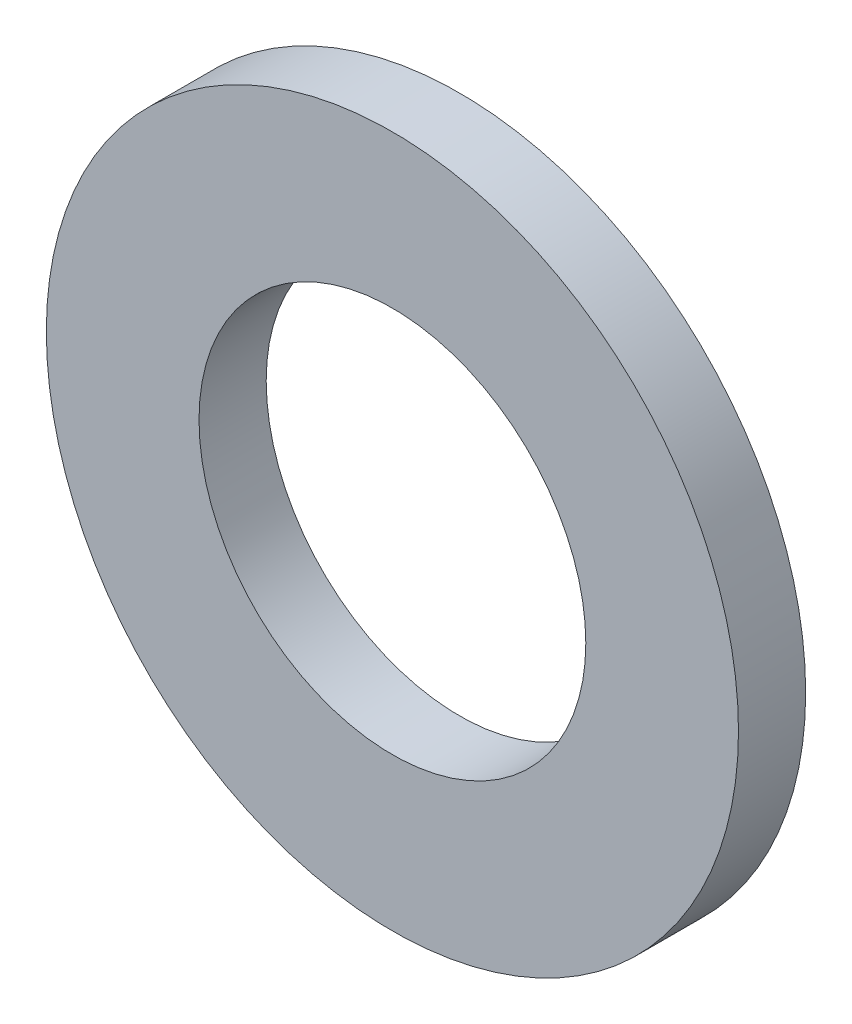
ISO-10303-21;
HEADER;
FILE_DESCRIPTION(('STEP AP214'),'2;1');
FILE_NAME('part.step','',(''),(''),'','','');
FILE_SCHEMA(('AUTOMOTIVE_DESIGN { 1 0 10303 214 1 1 1 1 }'));
ENDSEC;
DATA;
#1=APPLICATION_CONTEXT('core data for automotive mechanical design processes');
#2=APPLICATION_PROTOCOL_DEFINITION('international standard','automotive_design',2000,#1);
#3=PRODUCT_CONTEXT('',#1,'mechanical');
#4=PRODUCT('Part','Part','',(#3));
#5=PRODUCT_RELATED_PRODUCT_CATEGORY('part','',(#4));
#6=PRODUCT_DEFINITION_FORMATION('','',#4);
#7=PRODUCT_DEFINITION_CONTEXT('part definition',#1,'design');
#8=PRODUCT_DEFINITION('design','',#6,#7);
#9=PRODUCT_DEFINITION_SHAPE('','',#8);
#10=(LENGTH_UNIT() NAMED_UNIT(*) SI_UNIT(.MILLI.,.METRE.));
#11=(NAMED_UNIT(*) PLANE_ANGLE_UNIT() SI_UNIT($,.RADIAN.));
#12=(NAMED_UNIT(*) SI_UNIT($,.STERADIAN.) SOLID_ANGLE_UNIT());
#13=UNCERTAINTY_MEASURE_WITH_UNIT(LENGTH_MEASURE(1.E-05),#10,'distance_accuracy_value','');
#14=(GEOMETRIC_REPRESENTATION_CONTEXT(3) GLOBAL_UNCERTAINTY_ASSIGNED_CONTEXT((#13)) GLOBAL_UNIT_ASSIGNED_CONTEXT((#10,
#11,#12)) REPRESENTATION_CONTEXT('',''));
#15=CARTESIAN_POINT('',(0.,0.,0.));
#16=DIRECTION('',(0.,0.,1.));
#17=DIRECTION('',(1.,0.,0.));
#18=AXIS2_PLACEMENT_3D('',#15,#16,#17);
#19=CARTESIAN_POINT('',(1.11022302462516E-13,1.11022302462516E-13,3.29999999999997));
#20=DIRECTION('',(0.,0.,1.));
#21=DIRECTION('',(1.,0.,0.));
#22=AXIS2_PLACEMENT_3D('',#19,#20,#21);
#23=PLANE('',#22);
#24=CARTESIAN_POINT('',(1.11022302462516E-13,1.11022302462516E-13,3.29999999999997));
#25=DIRECTION('',(0.,0.,1.));
#26=DIRECTION('',(1.,0.,0.));
#27=AXIS2_PLACEMENT_3D('',#24,#25,#26);
#28=CIRCLE('',#27,17.);
#29=CARTESIAN_POINT('',(17.0000000000002,1.11022302462516E-13,3.29999999999997));
#30=VERTEX_POINT('',#29);
#31=EDGE_CURVE('E10',#30,#30,#28,.T.);
#32=ORIENTED_EDGE('',*,*,#31,.T.);
#33=EDGE_LOOP('',(#32));
#34=FACE_BOUND('',#33,.T.);
#35=CARTESIAN_POINT('',(1.11022302462516E-13,1.11022302462516E-13,3.29999999999997));
#36=DIRECTION('',(0.,0.,1.));
#37=DIRECTION('',(1.,0.,0.));
#38=AXIS2_PLACEMENT_3D('',#35,#36,#37);
#39=CIRCLE('',#38,9.5);
#40=CARTESIAN_POINT('',(9.50000000000014,1.11022302462516E-13,3.29999999999997));
#41=VERTEX_POINT('',#40);
#42=EDGE_CURVE('E39',#41,#41,#39,.T.);
#43=ORIENTED_EDGE('',*,*,#42,.F.);
#44=EDGE_LOOP('',(#43));
#45=FACE_BOUND('',#44,.T.);
#46=ADVANCED_FACE('F28',(#34,#45),#23,.T.);
#47=CARTESIAN_POINT('',(0.,0.,0.));
#48=DIRECTION('',(0.,0.,1.));
#49=DIRECTION('',(1.,0.,0.));
#50=AXIS2_PLACEMENT_3D('',#47,#48,#49);
#51=PLANE('',#50);
#52=CARTESIAN_POINT('',(0.,0.,0.));
#53=DIRECTION('',(0.,0.,1.));
#54=DIRECTION('',(1.,0.,0.));
#55=AXIS2_PLACEMENT_3D('',#52,#53,#54);
#56=CIRCLE('',#55,17.);
#57=CARTESIAN_POINT('',(17.0000000000001,0.,0.));
#58=VERTEX_POINT('',#57);
#59=EDGE_CURVE('E32',#58,#58,#56,.T.);
#60=ORIENTED_EDGE('',*,*,#59,.F.);
#61=EDGE_LOOP('',(#60));
#62=FACE_BOUND('',#61,.T.);
#63=CARTESIAN_POINT('',(0.,0.,0.));
#64=DIRECTION('',(0.,0.,1.));
#65=DIRECTION('',(1.,0.,0.));
#66=AXIS2_PLACEMENT_3D('',#63,#64,#65);
#67=CIRCLE('',#66,9.5);
#68=CARTESIAN_POINT('',(9.50000000000003,0.,0.));
#69=VERTEX_POINT('',#68);
#70=EDGE_CURVE('E41',#69,#69,#67,.T.);
#71=ORIENTED_EDGE('',*,*,#70,.T.);
#72=EDGE_LOOP('',(#71));
#73=FACE_BOUND('',#72,.T.);
#74=ADVANCED_FACE('F51',(#62,#73),#51,.F.);
#75=CARTESIAN_POINT('',(1.11022302462516E-13,1.11022302462516E-13,3.29999999999997));
#76=DIRECTION('',(0.,0.,-1.));
#77=DIRECTION('',(-1.,0.,0.));
#78=AXIS2_PLACEMENT_3D('',#75,#76,#77);
#79=CYLINDRICAL_SURFACE('',#78,17.);
#80=ORIENTED_EDGE('',*,*,#31,.F.);
#81=EDGE_LOOP('',(#80));
#82=FACE_BOUND('',#81,.T.);
#83=ORIENTED_EDGE('',*,*,#59,.T.);
#84=EDGE_LOOP('',(#83));
#85=FACE_BOUND('',#84,.T.);
#86=ADVANCED_FACE('F30',(#82,#85),#79,.T.);
#87=CARTESIAN_POINT('',(1.11022302462516E-13,1.11022302462516E-13,3.29999999999997));
#88=DIRECTION('',(0.,0.,-1.));
#89=DIRECTION('',(-1.,0.,0.));
#90=AXIS2_PLACEMENT_3D('',#87,#88,#89);
#91=CYLINDRICAL_SURFACE('',#90,9.5);
#92=ORIENTED_EDGE('',*,*,#42,.T.);
#93=EDGE_LOOP('',(#92));
#94=FACE_BOUND('',#93,.T.);
#95=ORIENTED_EDGE('',*,*,#70,.F.);
#96=EDGE_LOOP('',(#95));
#97=FACE_BOUND('',#96,.T.);
#98=ADVANCED_FACE('F47',(#94,#97),#91,.F.);
#99=CLOSED_SHELL('',(#46,#74,#86,#98));
#100=MANIFOLD_SOLID_BREP('B2',#99);
#101=ADVANCED_BREP_SHAPE_REPRESENTATION('',(#18,#100),#14);
#102=SHAPE_DEFINITION_REPRESENTATION(#9,#101);
ENDSEC;
END-ISO-10303-21;
